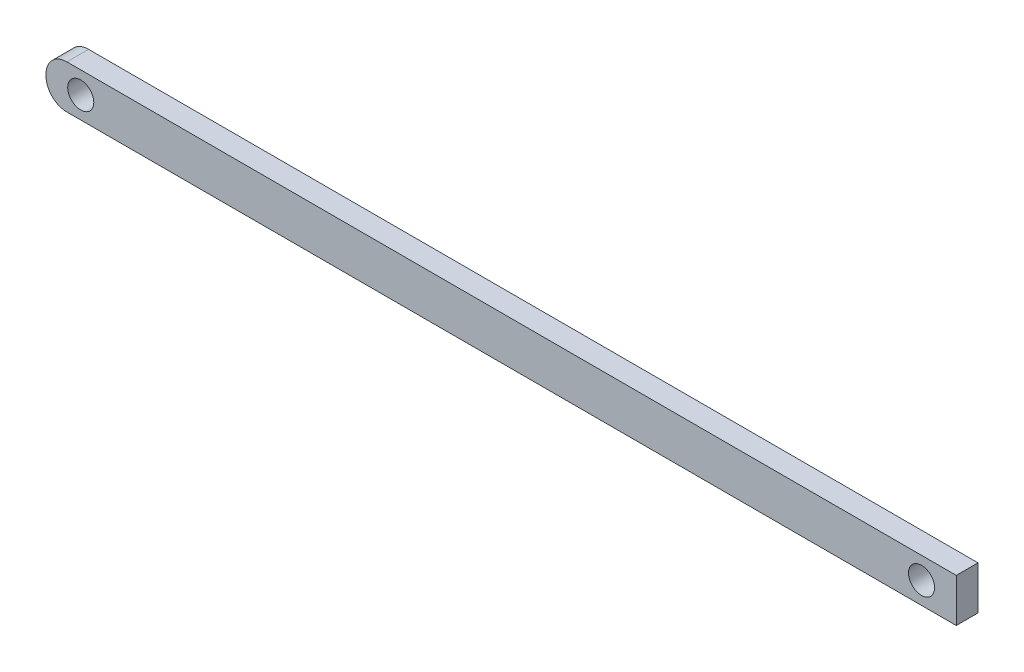
ISO-10303-21;
HEADER;
FILE_DESCRIPTION(('STEP AP214'),'2;1');
FILE_NAME('part.step','',(''),(''),'','','');
FILE_SCHEMA(('AUTOMOTIVE_DESIGN { 1 0 10303 214 1 1 1 1 }'));
ENDSEC;
DATA;
#1=APPLICATION_CONTEXT('core data for automotive mechanical design processes');
#2=APPLICATION_PROTOCOL_DEFINITION('international standard','automotive_design',2000,#1);
#3=PRODUCT_CONTEXT('',#1,'mechanical');
#4=PRODUCT('Part','Part','',(#3));
#5=PRODUCT_RELATED_PRODUCT_CATEGORY('part','',(#4));
#6=PRODUCT_DEFINITION_FORMATION('','',#4);
#7=PRODUCT_DEFINITION_CONTEXT('part definition',#1,'design');
#8=PRODUCT_DEFINITION('design','',#6,#7);
#9=PRODUCT_DEFINITION_SHAPE('','',#8);
#10=(LENGTH_UNIT() NAMED_UNIT(*) SI_UNIT(.MILLI.,.METRE.));
#11=(NAMED_UNIT(*) PLANE_ANGLE_UNIT() SI_UNIT($,.RADIAN.));
#12=(NAMED_UNIT(*) SI_UNIT($,.STERADIAN.) SOLID_ANGLE_UNIT());
#13=UNCERTAINTY_MEASURE_WITH_UNIT(LENGTH_MEASURE(1.E-05),#10,'distance_accuracy_value','');
#14=(GEOMETRIC_REPRESENTATION_CONTEXT(3) GLOBAL_UNCERTAINTY_ASSIGNED_CONTEXT((#13)) GLOBAL_UNIT_ASSIGNED_CONTEXT((#10,
#11,#12)) REPRESENTATION_CONTEXT('',''));
#15=CARTESIAN_POINT('',(0.,0.,0.));
#16=DIRECTION('',(0.,0.,1.));
#17=DIRECTION('',(1.,0.,0.));
#18=AXIS2_PLACEMENT_3D('',#15,#16,#17);
#19=CARTESIAN_POINT('',(-250.,-0.500000000000002,25.));
#20=DIRECTION('',(0.,0.,1.));
#21=DIRECTION('',(1.,0.,0.));
#22=AXIS2_PLACEMENT_3D('',#19,#20,#21);
#23=PLANE('',#22);
#24=CARTESIAN_POINT('',(-242.,0.,25.));
#25=DIRECTION('',(0.,0.,1.));
#26=DIRECTION('',(1.,0.,0.));
#27=AXIS2_PLACEMENT_3D('',#24,#25,#26);
#28=CIRCLE('',#27,7.50000000000001);
#29=CARTESIAN_POINT('',(-234.5,0.,25.));
#30=VERTEX_POINT('',#29);
#31=EDGE_CURVE('E145',#30,#30,#28,.T.);
#32=ORIENTED_EDGE('',*,*,#31,.F.);
#33=EDGE_LOOP('',(#32));
#34=FACE_BOUND('',#33,.T.);
#35=DIRECTION('',(0.,1.,0.));
#36=VECTOR('',#35,1.);
#37=CARTESIAN_POINT('',(262.,12.5,25.));
#38=LINE('',#37,#36);
#39=CARTESIAN_POINT('',(262.,-12.5,25.));
#40=VERTEX_POINT('',#39);
#41=CARTESIAN_POINT('',(262.,12.5,25.));
#42=VERTEX_POINT('',#41);
#43=EDGE_CURVE('E148',#40,#42,#38,.T.);
#44=ORIENTED_EDGE('',*,*,#43,.T.);
#45=DIRECTION('',(-1.,0.,0.));
#46=VECTOR('',#45,1.);
#47=CARTESIAN_POINT('',(-250.,12.5,25.));
#48=LINE('',#47,#46);
#49=CARTESIAN_POINT('',(-250.,12.5,25.));
#50=VERTEX_POINT('',#49);
#51=EDGE_CURVE('E132',#42,#50,#48,.T.);
#52=ORIENTED_EDGE('',*,*,#51,.T.);
#53=CARTESIAN_POINT('',(-250.,0.500000000000002,25.));
#54=DIRECTION('',(0.,0.,1.));
#55=DIRECTION('',(-1.,0.,0.));
#56=AXIS2_PLACEMENT_3D('',#53,#54,#55);
#57=CIRCLE('',#56,12.);
#58=CARTESIAN_POINT('',(-262.,0.499999999999915,25.));
#59=VERTEX_POINT('',#58);
#60=EDGE_CURVE('E128',#50,#59,#57,.T.);
#61=ORIENTED_EDGE('',*,*,#60,.T.);
#62=DIRECTION('',(0.,-1.,0.));
#63=VECTOR('',#62,1.);
#64=CARTESIAN_POINT('',(-262.,0.499999999999915,25.));
#65=LINE('',#64,#63);
#66=CARTESIAN_POINT('',(-262.,-0.499999999999915,25.));
#67=VERTEX_POINT('',#66);
#68=EDGE_CURVE('E152',#59,#67,#65,.T.);
#69=ORIENTED_EDGE('',*,*,#68,.T.);
#70=CARTESIAN_POINT('',(-250.,-0.500000000000002,25.));
#71=DIRECTION('',(0.,0.,1.));
#72=DIRECTION('',(1.,0.,0.));
#73=AXIS2_PLACEMENT_3D('',#70,#71,#72);
#74=CIRCLE('',#73,12.);
#75=CARTESIAN_POINT('',(-250.,-12.5,25.));
#76=VERTEX_POINT('',#75);
#77=EDGE_CURVE('E154',#67,#76,#74,.T.);
#78=ORIENTED_EDGE('',*,*,#77,.T.);
#79=DIRECTION('',(1.,0.,0.));
#80=VECTOR('',#79,1.);
#81=CARTESIAN_POINT('',(-250.,-12.5,25.));
#82=LINE('',#81,#80);
#83=EDGE_CURVE('E62',#76,#40,#82,.T.);
#84=ORIENTED_EDGE('',*,*,#83,.T.);
#85=EDGE_LOOP('',(#44,#52,#61,#69,#78,#84));
#86=FACE_BOUND('',#85,.T.);
#87=CARTESIAN_POINT('',(242.,0.,25.));
#88=DIRECTION('',(0.,0.,1.));
#89=DIRECTION('',(1.,0.,0.));
#90=AXIS2_PLACEMENT_3D('',#87,#88,#89);
#91=CIRCLE('',#90,7.50000000000001);
#92=CARTESIAN_POINT('',(249.5,0.,25.));
#93=VERTEX_POINT('',#92);
#94=EDGE_CURVE('E142',#93,#93,#91,.T.);
#95=ORIENTED_EDGE('',*,*,#94,.F.);
#96=EDGE_LOOP('',(#95));
#97=FACE_BOUND('',#96,.T.);
#98=ADVANCED_FACE('F38',(#34,#86,#97),#23,.T.);
#99=CARTESIAN_POINT('',(262.,12.5,25.));
#100=DIRECTION('',(-1.,0.,0.));
#101=DIRECTION('',(0.,0.,1.));
#102=AXIS2_PLACEMENT_3D('',#99,#100,#101);
#103=PLANE('',#102);
#104=DIRECTION('',(0.,0.,-1.));
#105=VECTOR('',#104,1.);
#106=CARTESIAN_POINT('',(262.,-12.5,25.));
#107=LINE('',#106,#105);
#108=CARTESIAN_POINT('',(262.,-12.5,12.5));
#109=VERTEX_POINT('',#108);
#110=EDGE_CURVE('E112',#40,#109,#107,.T.);
#111=ORIENTED_EDGE('',*,*,#110,.T.);
#112=DIRECTION('',(0.,1.,0.));
#113=VECTOR('',#112,1.);
#114=CARTESIAN_POINT('',(262.,12.5,12.5));
#115=LINE('',#114,#113);
#116=CARTESIAN_POINT('',(262.,12.5,12.5));
#117=VERTEX_POINT('',#116);
#118=EDGE_CURVE('E54',#109,#117,#115,.T.);
#119=ORIENTED_EDGE('',*,*,#118,.T.);
#120=DIRECTION('',(0.,0.,-1.));
#121=VECTOR('',#120,1.);
#122=CARTESIAN_POINT('',(262.,12.5,25.));
#123=LINE('',#122,#121);
#124=EDGE_CURVE('E11',#42,#117,#123,.T.);
#125=ORIENTED_EDGE('',*,*,#124,.F.);
#126=ORIENTED_EDGE('',*,*,#43,.F.);
#127=EDGE_LOOP('',(#111,#119,#125,#126));
#128=FACE_BOUND('',#127,.T.);
#129=ADVANCED_FACE('F40',(#128),#103,.F.);
#130=CARTESIAN_POINT('',(-250.,12.5,25.));
#131=DIRECTION('',(0.,-1.,0.));
#132=DIRECTION('',(0.,0.,-1.));
#133=AXIS2_PLACEMENT_3D('',#130,#131,#132);
#134=PLANE('',#133);
#135=ORIENTED_EDGE('',*,*,#124,.T.);
#136=DIRECTION('',(1.,0.,0.));
#137=VECTOR('',#136,1.);
#138=CARTESIAN_POINT('',(-262.,12.5,12.5));
#139=LINE('',#138,#137);
#140=CARTESIAN_POINT('',(-250.,12.5,12.5));
#141=VERTEX_POINT('',#140);
#142=EDGE_CURVE('E98',#141,#117,#139,.T.);
#143=ORIENTED_EDGE('',*,*,#142,.F.);
#144=DIRECTION('',(0.,0.,-1.));
#145=VECTOR('',#144,1.);
#146=CARTESIAN_POINT('',(-250.,12.5,25.));
#147=LINE('',#146,#145);
#148=EDGE_CURVE('E47',#50,#141,#147,.T.);
#149=ORIENTED_EDGE('',*,*,#148,.F.);
#150=ORIENTED_EDGE('',*,*,#51,.F.);
#151=EDGE_LOOP('',(#135,#143,#149,#150));
#152=FACE_BOUND('',#151,.T.);
#153=ADVANCED_FACE('F131',(#152),#134,.F.);
#154=CARTESIAN_POINT('',(-250.,0.500000000000002,25.));
#155=DIRECTION('',(0.,0.,-1.));
#156=DIRECTION('',(-1.,0.,0.));
#157=AXIS2_PLACEMENT_3D('',#154,#155,#156);
#158=CYLINDRICAL_SURFACE('',#157,12.);
#159=ORIENTED_EDGE('',*,*,#148,.T.);
#160=CARTESIAN_POINT('',(-250.,0.500000000000002,12.5));
#161=DIRECTION('',(0.,0.,1.));
#162=DIRECTION('',(1.,0.,0.));
#163=AXIS2_PLACEMENT_3D('',#160,#161,#162);
#164=CIRCLE('',#163,12.);
#165=CARTESIAN_POINT('',(-262.,0.499999999999915,12.5));
#166=VERTEX_POINT('',#165);
#167=EDGE_CURVE('E108',#141,#166,#164,.T.);
#168=ORIENTED_EDGE('',*,*,#167,.T.);
#169=DIRECTION('',(0.,0.,-1.));
#170=VECTOR('',#169,1.);
#171=CARTESIAN_POINT('',(-262.,0.499999999999915,25.));
#172=LINE('',#171,#170);
#173=EDGE_CURVE('E114',#59,#166,#172,.T.);
#174=ORIENTED_EDGE('',*,*,#173,.F.);
#175=ORIENTED_EDGE('',*,*,#60,.F.);
#176=EDGE_LOOP('',(#159,#168,#174,#175));
#177=FACE_BOUND('',#176,.T.);
#178=ADVANCED_FACE('F126',(#177),#158,.T.);
#179=CARTESIAN_POINT('',(-262.,0.499999999999915,25.));
#180=DIRECTION('',(1.,0.,0.));
#181=DIRECTION('',(0.,0.,-1.));
#182=AXIS2_PLACEMENT_3D('',#179,#180,#181);
#183=PLANE('',#182);
#184=ORIENTED_EDGE('',*,*,#173,.T.);
#185=DIRECTION('',(0.,-1.,0.));
#186=VECTOR('',#185,1.);
#187=CARTESIAN_POINT('',(-262.,12.5,12.5));
#188=LINE('',#187,#186);
#189=CARTESIAN_POINT('',(-262.,-0.500000000000002,12.5));
#190=VERTEX_POINT('',#189);
#191=EDGE_CURVE('E134',#166,#190,#188,.T.);
#192=ORIENTED_EDGE('',*,*,#191,.T.);
#193=DIRECTION('',(0.,0.,-1.));
#194=VECTOR('',#193,1.);
#195=CARTESIAN_POINT('',(-262.,-0.499999999999915,25.));
#196=LINE('',#195,#194);
#197=EDGE_CURVE('E107',#67,#190,#196,.T.);
#198=ORIENTED_EDGE('',*,*,#197,.F.);
#199=ORIENTED_EDGE('',*,*,#68,.F.);
#200=EDGE_LOOP('',(#184,#192,#198,#199));
#201=FACE_BOUND('',#200,.T.);
#202=ADVANCED_FACE('F158',(#201),#183,.F.);
#203=CARTESIAN_POINT('',(-250.,-0.500000000000002,25.));
#204=DIRECTION('',(0.,0.,-1.));
#205=DIRECTION('',(-1.,0.,0.));
#206=AXIS2_PLACEMENT_3D('',#203,#204,#205);
#207=CYLINDRICAL_SURFACE('',#206,12.);
#208=ORIENTED_EDGE('',*,*,#197,.T.);
#209=CARTESIAN_POINT('',(-250.,-0.500000000000002,12.5));
#210=DIRECTION('',(0.,0.,1.));
#211=DIRECTION('',(1.,0.,0.));
#212=AXIS2_PLACEMENT_3D('',#209,#210,#211);
#213=CIRCLE('',#212,12.);
#214=CARTESIAN_POINT('',(-250.,-12.5,12.5));
#215=VERTEX_POINT('',#214);
#216=EDGE_CURVE('E93',#190,#215,#213,.T.);
#217=ORIENTED_EDGE('',*,*,#216,.T.);
#218=DIRECTION('',(0.,0.,-1.));
#219=VECTOR('',#218,1.);
#220=CARTESIAN_POINT('',(-250.,-12.5,25.));
#221=LINE('',#220,#219);
#222=EDGE_CURVE('E105',#76,#215,#221,.T.);
#223=ORIENTED_EDGE('',*,*,#222,.F.);
#224=ORIENTED_EDGE('',*,*,#77,.F.);
#225=EDGE_LOOP('',(#208,#217,#223,#224));
#226=FACE_BOUND('',#225,.T.);
#227=ADVANCED_FACE('F103',(#226),#207,.T.);
#228=CARTESIAN_POINT('',(-250.,-12.5,25.));
#229=DIRECTION('',(0.,1.,0.));
#230=DIRECTION('',(0.,0.,1.));
#231=AXIS2_PLACEMENT_3D('',#228,#229,#230);
#232=PLANE('',#231);
#233=ORIENTED_EDGE('',*,*,#222,.T.);
#234=DIRECTION('',(1.,0.,0.));
#235=VECTOR('',#234,1.);
#236=CARTESIAN_POINT('',(-262.,-12.5,12.5));
#237=LINE('',#236,#235);
#238=EDGE_CURVE('E90',#215,#109,#237,.T.);
#239=ORIENTED_EDGE('',*,*,#238,.T.);
#240=ORIENTED_EDGE('',*,*,#110,.F.);
#241=ORIENTED_EDGE('',*,*,#83,.F.);
#242=EDGE_LOOP('',(#233,#239,#240,#241));
#243=FACE_BOUND('',#242,.T.);
#244=ADVANCED_FACE('F111',(#243),#232,.F.);
#245=CARTESIAN_POINT('',(-242.,0.,25.));
#246=DIRECTION('',(0.,0.,-1.));
#247=DIRECTION('',(-1.,0.,0.));
#248=AXIS2_PLACEMENT_3D('',#245,#246,#247);
#249=CYLINDRICAL_SURFACE('',#248,7.50000000000001);
#250=CARTESIAN_POINT('',(-242.,0.,12.5));
#251=DIRECTION('',(0.,0.,1.));
#252=DIRECTION('',(1.,0.,0.));
#253=AXIS2_PLACEMENT_3D('',#250,#251,#252);
#254=CIRCLE('',#253,7.50000000000001);
#255=CARTESIAN_POINT('',(-234.5,0.,12.5));
#256=VERTEX_POINT('',#255);
#257=EDGE_CURVE('E109',#256,#256,#254,.T.);
#258=ORIENTED_EDGE('',*,*,#257,.F.);
#259=EDGE_LOOP('',(#258));
#260=FACE_BOUND('',#259,.T.);
#261=ORIENTED_EDGE('',*,*,#31,.T.);
#262=EDGE_LOOP('',(#261));
#263=FACE_BOUND('',#262,.T.);
#264=ADVANCED_FACE('F177',(#260,#263),#249,.F.);
#265=CARTESIAN_POINT('',(242.,0.,25.));
#266=DIRECTION('',(0.,0.,-1.));
#267=DIRECTION('',(-1.,0.,0.));
#268=AXIS2_PLACEMENT_3D('',#265,#266,#267);
#269=CYLINDRICAL_SURFACE('',#268,7.50000000000001);
#270=CARTESIAN_POINT('',(242.,0.,12.5));
#271=DIRECTION('',(0.,0.,1.));
#272=DIRECTION('',(1.,0.,0.));
#273=AXIS2_PLACEMENT_3D('',#270,#271,#272);
#274=CIRCLE('',#273,7.50000000000001);
#275=CARTESIAN_POINT('',(249.5,0.,12.5));
#276=VERTEX_POINT('',#275);
#277=EDGE_CURVE('E42',#276,#276,#274,.T.);
#278=ORIENTED_EDGE('',*,*,#277,.F.);
#279=EDGE_LOOP('',(#278));
#280=FACE_BOUND('',#279,.T.);
#281=ORIENTED_EDGE('',*,*,#94,.T.);
#282=EDGE_LOOP('',(#281));
#283=FACE_BOUND('',#282,.T.);
#284=ADVANCED_FACE('F183',(#280,#283),#269,.F.);
#285=CARTESIAN_POINT('',(-262.,12.5,12.5));
#286=DIRECTION('',(0.,0.,1.));
#287=DIRECTION('',(1.,0.,0.));
#288=AXIS2_PLACEMENT_3D('',#285,#286,#287);
#289=PLANE('',#288);
#290=ORIENTED_EDGE('',*,*,#257,.T.);
#291=EDGE_LOOP('',(#290));
#292=FACE_BOUND('',#291,.T.);
#293=ORIENTED_EDGE('',*,*,#277,.T.);
#294=EDGE_LOOP('',(#293));
#295=FACE_BOUND('',#294,.T.);
#296=ORIENTED_EDGE('',*,*,#238,.F.);
#297=ORIENTED_EDGE('',*,*,#216,.F.);
#298=ORIENTED_EDGE('',*,*,#191,.F.);
#299=ORIENTED_EDGE('',*,*,#167,.F.);
#300=ORIENTED_EDGE('',*,*,#142,.T.);
#301=ORIENTED_EDGE('',*,*,#118,.F.);
#302=EDGE_LOOP('',(#296,#297,#298,#299,#300,#301));
#303=FACE_BOUND('',#302,.T.);
#304=ADVANCED_FACE('F92',(#292,#295,#303),#289,.F.);
#305=CLOSED_SHELL('',(#98,#129,#153,#178,#202,#227,#244,#264,#284,#304));
#306=MANIFOLD_SOLID_BREP('B2',#305);
#307=ADVANCED_BREP_SHAPE_REPRESENTATION('',(#18,#306),#14);
#308=SHAPE_DEFINITION_REPRESENTATION(#9,#307);
ENDSEC;
END-ISO-10303-21;
